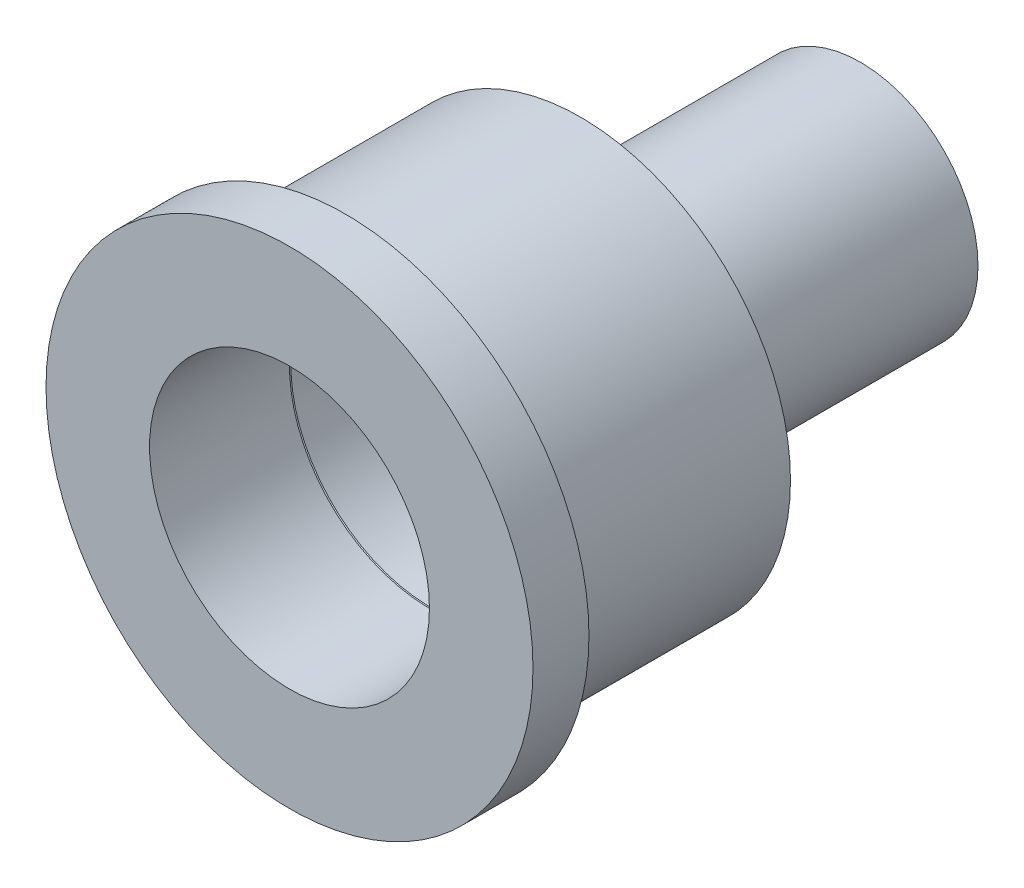
ISO-10303-21;
HEADER;
FILE_DESCRIPTION(('STEP AP214'),'2;1');
FILE_NAME('part.step','',(''),(''),'','','');
FILE_SCHEMA(('AUTOMOTIVE_DESIGN { 1 0 10303 214 1 1 1 1 }'));
ENDSEC;
DATA;
#1=APPLICATION_CONTEXT('core data for automotive mechanical design processes');
#2=APPLICATION_PROTOCOL_DEFINITION('international standard','automotive_design',2000,#1);
#3=PRODUCT_CONTEXT('',#1,'mechanical');
#4=PRODUCT('Part','Part','',(#3));
#5=PRODUCT_RELATED_PRODUCT_CATEGORY('part','',(#4));
#6=PRODUCT_DEFINITION_FORMATION('','',#4);
#7=PRODUCT_DEFINITION_CONTEXT('part definition',#1,'design');
#8=PRODUCT_DEFINITION('design','',#6,#7);
#9=PRODUCT_DEFINITION_SHAPE('','',#8);
#10=(LENGTH_UNIT() NAMED_UNIT(*) SI_UNIT(.MILLI.,.METRE.));
#11=(NAMED_UNIT(*) PLANE_ANGLE_UNIT() SI_UNIT($,.RADIAN.));
#12=(NAMED_UNIT(*) SI_UNIT($,.STERADIAN.) SOLID_ANGLE_UNIT());
#13=UNCERTAINTY_MEASURE_WITH_UNIT(LENGTH_MEASURE(1.E-05),#10,'distance_accuracy_value','');
#14=(GEOMETRIC_REPRESENTATION_CONTEXT(3) GLOBAL_UNCERTAINTY_ASSIGNED_CONTEXT((#13)) GLOBAL_UNIT_ASSIGNED_CONTEXT((#10,
#11,#12)) REPRESENTATION_CONTEXT('',''));
#15=CARTESIAN_POINT('',(0.,0.,0.));
#16=DIRECTION('',(0.,0.,1.));
#17=DIRECTION('',(1.,0.,0.));
#18=AXIS2_PLACEMENT_3D('',#15,#16,#17);
#19=CARTESIAN_POINT('',(0.,0.,5.));
#20=DIRECTION('',(0.,0.,-1.));
#21=DIRECTION('',(-1.,0.,0.));
#22=AXIS2_PLACEMENT_3D('',#19,#20,#21);
#23=CYLINDRICAL_SURFACE('',#22,2.1);
#24=CARTESIAN_POINT('',(0.,0.,5.));
#25=DIRECTION('',(0.,0.,1.));
#26=DIRECTION('',(1.,0.,0.));
#27=AXIS2_PLACEMENT_3D('',#24,#25,#26);
#28=CIRCLE('',#27,2.1);
#29=CARTESIAN_POINT('',(2.1,0.,5.));
#30=VERTEX_POINT('',#29);
#31=EDGE_CURVE('E10',#30,#30,#28,.T.);
#32=ORIENTED_EDGE('',*,*,#31,.F.);
#33=EDGE_LOOP('',(#32));
#34=FACE_BOUND('',#33,.T.);
#35=CARTESIAN_POINT('',(0.,0.,0.));
#36=DIRECTION('',(0.,0.,1.));
#37=DIRECTION('',(1.,0.,0.));
#38=AXIS2_PLACEMENT_3D('',#35,#36,#37);
#39=CIRCLE('',#38,2.1);
#40=CARTESIAN_POINT('',(2.1,0.,0.));
#41=VERTEX_POINT('',#40);
#42=EDGE_CURVE('E38',#41,#41,#39,.T.);
#43=ORIENTED_EDGE('',*,*,#42,.T.);
#44=EDGE_LOOP('',(#43));
#45=FACE_BOUND('',#44,.T.);
#46=ADVANCED_FACE('F31',(#34,#45),#23,.T.);
#47=CARTESIAN_POINT('',(0.,0.,0.));
#48=DIRECTION('',(0.,0.,1.));
#49=DIRECTION('',(1.,0.,0.));
#50=AXIS2_PLACEMENT_3D('',#47,#48,#49);
#51=PLANE('',#50);
#52=CARTESIAN_POINT('',(0.,0.,0.));
#53=DIRECTION('',(0.,0.,1.));
#54=DIRECTION('',(1.,0.,0.));
#55=AXIS2_PLACEMENT_3D('',#52,#53,#54);
#56=CIRCLE('',#55,1.3);
#57=CARTESIAN_POINT('',(1.3,0.,0.));
#58=VERTEX_POINT('',#57);
#59=EDGE_CURVE('E34',#58,#58,#56,.T.);
#60=ORIENTED_EDGE('',*,*,#59,.T.);
#61=EDGE_LOOP('',(#60));
#62=FACE_BOUND('',#61,.T.);
#63=ORIENTED_EDGE('',*,*,#42,.F.);
#64=EDGE_LOOP('',(#63));
#65=FACE_BOUND('',#64,.T.);
#66=ADVANCED_FACE('F111',(#62,#65),#51,.F.);
#67=CARTESIAN_POINT('',(0.,0.,9.2));
#68=DIRECTION('',(0.,0.,-1.));
#69=DIRECTION('',(-1.,0.,0.));
#70=AXIS2_PLACEMENT_3D('',#67,#68,#69);
#71=CYLINDRICAL_SURFACE('',#70,3.75);
#72=CARTESIAN_POINT('',(0.,0.,9.2));
#73=DIRECTION('',(0.,0.,1.));
#74=DIRECTION('',(1.,0.,0.));
#75=AXIS2_PLACEMENT_3D('',#72,#73,#74);
#76=CIRCLE('',#75,3.75);
#77=CARTESIAN_POINT('',(3.75,0.,9.2));
#78=VERTEX_POINT('',#77);
#79=EDGE_CURVE('E43',#78,#78,#76,.T.);
#80=ORIENTED_EDGE('',*,*,#79,.F.);
#81=EDGE_LOOP('',(#80));
#82=FACE_BOUND('',#81,.T.);
#83=CARTESIAN_POINT('',(0.,0.,5.));
#84=DIRECTION('',(0.,0.,1.));
#85=DIRECTION('',(1.,0.,0.));
#86=AXIS2_PLACEMENT_3D('',#83,#84,#85);
#87=CIRCLE('',#86,3.75);
#88=CARTESIAN_POINT('',(3.75,0.,5.));
#89=VERTEX_POINT('',#88);
#90=EDGE_CURVE('E45',#89,#89,#87,.T.);
#91=ORIENTED_EDGE('',*,*,#90,.T.);
#92=EDGE_LOOP('',(#91));
#93=FACE_BOUND('',#92,.T.);
#94=ADVANCED_FACE('F116',(#82,#93),#71,.T.);
#95=CARTESIAN_POINT('',(0.,0.,5.));
#96=DIRECTION('',(0.,0.,1.));
#97=DIRECTION('',(1.,0.,0.));
#98=AXIS2_PLACEMENT_3D('',#95,#96,#97);
#99=PLANE('',#98);
#100=ORIENTED_EDGE('',*,*,#31,.T.);
#101=EDGE_LOOP('',(#100));
#102=FACE_BOUND('',#101,.T.);
#103=ORIENTED_EDGE('',*,*,#90,.F.);
#104=EDGE_LOOP('',(#103));
#105=FACE_BOUND('',#104,.T.);
#106=ADVANCED_FACE('F101',(#102,#105),#99,.F.);
#107=CARTESIAN_POINT('',(0.,0.,10.2));
#108=DIRECTION('',(0.,0.,-1.));
#109=DIRECTION('',(-1.,0.,0.));
#110=AXIS2_PLACEMENT_3D('',#107,#108,#109);
#111=CYLINDRICAL_SURFACE('',#110,4.35);
#112=CARTESIAN_POINT('',(0.,0.,10.2));
#113=DIRECTION('',(0.,0.,1.));
#114=DIRECTION('',(1.,0.,0.));
#115=AXIS2_PLACEMENT_3D('',#112,#113,#114);
#116=CIRCLE('',#115,4.35);
#117=CARTESIAN_POINT('',(4.35,0.,10.2));
#118=VERTEX_POINT('',#117);
#119=EDGE_CURVE('E48',#118,#118,#116,.T.);
#120=ORIENTED_EDGE('',*,*,#119,.F.);
#121=EDGE_LOOP('',(#120));
#122=FACE_BOUND('',#121,.T.);
#123=CARTESIAN_POINT('',(0.,0.,9.2));
#124=DIRECTION('',(0.,0.,1.));
#125=DIRECTION('',(1.,0.,0.));
#126=AXIS2_PLACEMENT_3D('',#123,#124,#125);
#127=CIRCLE('',#126,4.35);
#128=CARTESIAN_POINT('',(4.35,0.,9.2));
#129=VERTEX_POINT('',#128);
#130=EDGE_CURVE('E51',#129,#129,#127,.T.);
#131=ORIENTED_EDGE('',*,*,#130,.T.);
#132=EDGE_LOOP('',(#131));
#133=FACE_BOUND('',#132,.T.);
#134=ADVANCED_FACE('F95',(#122,#133),#111,.T.);
#135=CARTESIAN_POINT('',(0.,0.,10.2));
#136=DIRECTION('',(0.,0.,1.));
#137=DIRECTION('',(1.,0.,0.));
#138=AXIS2_PLACEMENT_3D('',#135,#136,#137);
#139=PLANE('',#138);
#140=CARTESIAN_POINT('',(0.,0.,10.2));
#141=DIRECTION('',(0.,0.,1.));
#142=DIRECTION('',(1.,0.,0.));
#143=AXIS2_PLACEMENT_3D('',#140,#141,#142);
#144=CIRCLE('',#143,2.5);
#145=CARTESIAN_POINT('',(2.5,0.,10.2));
#146=VERTEX_POINT('',#145);
#147=EDGE_CURVE('E54',#146,#146,#144,.T.);
#148=ORIENTED_EDGE('',*,*,#147,.F.);
#149=EDGE_LOOP('',(#148));
#150=FACE_BOUND('',#149,.T.);
#151=ORIENTED_EDGE('',*,*,#119,.T.);
#152=EDGE_LOOP('',(#151));
#153=FACE_BOUND('',#152,.T.);
#154=ADVANCED_FACE('F92',(#150,#153),#139,.T.);
#155=CARTESIAN_POINT('',(0.,0.,9.2));
#156=DIRECTION('',(0.,0.,1.));
#157=DIRECTION('',(1.,0.,0.));
#158=AXIS2_PLACEMENT_3D('',#155,#156,#157);
#159=PLANE('',#158);
#160=ORIENTED_EDGE('',*,*,#79,.T.);
#161=EDGE_LOOP('',(#160));
#162=FACE_BOUND('',#161,.T.);
#163=ORIENTED_EDGE('',*,*,#130,.F.);
#164=EDGE_LOOP('',(#163));
#165=FACE_BOUND('',#164,.T.);
#166=ADVANCED_FACE('F88',(#162,#165),#159,.F.);
#167=CARTESIAN_POINT('',(0.,0.,7.7));
#168=DIRECTION('',(0.,0.,1.));
#169=DIRECTION('',(1.,0.,0.));
#170=AXIS2_PLACEMENT_3D('',#167,#168,#169);
#171=CYLINDRICAL_SURFACE('',#170,2.5);
#172=CARTESIAN_POINT('',(0.,0.,7.7));
#173=DIRECTION('',(0.,0.,1.));
#174=DIRECTION('',(1.,0.,0.));
#175=AXIS2_PLACEMENT_3D('',#172,#173,#174);
#176=CIRCLE('',#175,2.5);
#177=CARTESIAN_POINT('',(2.5,0.,7.7));
#178=VERTEX_POINT('',#177);
#179=EDGE_CURVE('E59',#178,#178,#176,.F.);
#180=ORIENTED_EDGE('',*,*,#179,.T.);
#181=EDGE_LOOP('',(#180));
#182=FACE_BOUND('',#181,.T.);
#183=ORIENTED_EDGE('',*,*,#147,.T.);
#184=EDGE_LOOP('',(#183));
#185=FACE_BOUND('',#184,.T.);
#186=ADVANCED_FACE('F85',(#182,#185),#171,.F.);
#187=CARTESIAN_POINT('',(0.,0.,7.7));
#188=DIRECTION('',(0.,0.,1.));
#189=DIRECTION('',(1.,0.,0.));
#190=AXIS2_PLACEMENT_3D('',#187,#188,#189);
#191=CYLINDRICAL_SURFACE('',#190,1.3);
#192=CARTESIAN_POINT('',(0.,0.,6.1));
#193=DIRECTION('',(0.,0.,1.));
#194=DIRECTION('',(1.,0.,0.));
#195=AXIS2_PLACEMENT_3D('',#192,#193,#194);
#196=CIRCLE('',#195,1.3);
#197=CARTESIAN_POINT('',(1.3,0.,6.1));
#198=VERTEX_POINT('',#197);
#199=EDGE_CURVE('E62',#198,#198,#196,.T.);
#200=ORIENTED_EDGE('',*,*,#199,.T.);
#201=EDGE_LOOP('',(#200));
#202=FACE_BOUND('',#201,.T.);
#203=ORIENTED_EDGE('',*,*,#59,.F.);
#204=EDGE_LOOP('',(#203));
#205=FACE_BOUND('',#204,.T.);
#206=ADVANCED_FACE('F81',(#202,#205),#191,.F.);
#207=CARTESIAN_POINT('',(2.525,0.,7.7));
#208=DIRECTION('',(0.,0.,1.));
#209=DIRECTION('',(1.,0.,0.));
#210=AXIS2_PLACEMENT_3D('',#207,#208,#209);
#211=PLANE('',#210);
#212=CARTESIAN_POINT('',(0.,0.,7.7));
#213=DIRECTION('',(0.,0.,1.));
#214=DIRECTION('',(1.,0.,0.));
#215=AXIS2_PLACEMENT_3D('',#212,#213,#214);
#216=CIRCLE('',#215,2.525);
#217=CARTESIAN_POINT('',(2.525,0.,7.7));
#218=VERTEX_POINT('',#217);
#219=EDGE_CURVE('E71',#218,#218,#216,.T.);
#220=ORIENTED_EDGE('',*,*,#219,.F.);
#221=EDGE_LOOP('',(#220));
#222=FACE_BOUND('',#221,.T.);
#223=ORIENTED_EDGE('',*,*,#179,.F.);
#224=EDGE_LOOP('',(#223));
#225=FACE_BOUND('',#224,.T.);
#226=ADVANCED_FACE('F77',(#222,#225),#211,.F.);
#227=CARTESIAN_POINT('',(1.3,0.,6.1));
#228=DIRECTION('',(0.,0.,-1.));
#229=DIRECTION('',(-1.,0.,0.));
#230=AXIS2_PLACEMENT_3D('',#227,#228,#229);
#231=PLANE('',#230);
#232=ORIENTED_EDGE('',*,*,#199,.F.);
#233=EDGE_LOOP('',(#232));
#234=FACE_BOUND('',#233,.T.);
#235=CARTESIAN_POINT('',(0.,0.,6.1));
#236=DIRECTION('',(0.,0.,1.));
#237=DIRECTION('',(1.,0.,0.));
#238=AXIS2_PLACEMENT_3D('',#235,#236,#237);
#239=CIRCLE('',#238,2.5);
#240=CARTESIAN_POINT('',(2.5,0.,6.1));
#241=VERTEX_POINT('',#240);
#242=EDGE_CURVE('E65',#241,#241,#239,.T.);
#243=ORIENTED_EDGE('',*,*,#242,.T.);
#244=EDGE_LOOP('',(#243));
#245=FACE_BOUND('',#244,.T.);
#246=ADVANCED_FACE('F80',(#234,#245),#231,.F.);
#247=CARTESIAN_POINT('',(0.,0.,7.7));
#248=DIRECTION('',(0.,0.,1.));
#249=DIRECTION('',(1.,0.,0.));
#250=AXIS2_PLACEMENT_3D('',#247,#248,#249);
#251=CYLINDRICAL_SURFACE('',#250,2.5);
#252=ORIENTED_EDGE('',*,*,#242,.F.);
#253=EDGE_LOOP('',(#252));
#254=FACE_BOUND('',#253,.T.);
#255=CARTESIAN_POINT('',(0.,0.,7.675));
#256=DIRECTION('',(0.,0.,1.));
#257=DIRECTION('',(1.,0.,0.));
#258=AXIS2_PLACEMENT_3D('',#255,#256,#257);
#259=CIRCLE('',#258,2.5);
#260=CARTESIAN_POINT('',(2.5,0.,7.675));
#261=VERTEX_POINT('',#260);
#262=EDGE_CURVE('E68',#261,#261,#259,.T.);
#263=ORIENTED_EDGE('',*,*,#262,.T.);
#264=EDGE_LOOP('',(#263));
#265=FACE_BOUND('',#264,.T.);
#266=ADVANCED_FACE('F182',(#254,#265),#251,.F.);
#267=CARTESIAN_POINT('',(0.,0.,7.7));
#268=DIRECTION('',(0.,0.,1.));
#269=DIRECTION('',(1.,0.,0.));
#270=AXIS2_PLACEMENT_3D('',#267,#268,#269);
#271=CONICAL_SURFACE('',#270,2.525,0.785398163397483);
#272=ORIENTED_EDGE('',*,*,#262,.F.);
#273=EDGE_LOOP('',(#272));
#274=FACE_BOUND('',#273,.T.);
#275=ORIENTED_EDGE('',*,*,#219,.T.);
#276=EDGE_LOOP('',(#275));
#277=FACE_BOUND('',#276,.T.);
#278=ADVANCED_FACE('F75',(#274,#277),#271,.F.);
#279=CLOSED_SHELL('',(#46,#66,#94,#106,#134,#154,#166,#186,#206,#226,#246,#266,#278));
#280=MANIFOLD_SOLID_BREP('B2',#279);
#281=ADVANCED_BREP_SHAPE_REPRESENTATION('',(#18,#280),#14);
#282=SHAPE_DEFINITION_REPRESENTATION(#9,#281);
ENDSEC;
END-ISO-10303-21;
